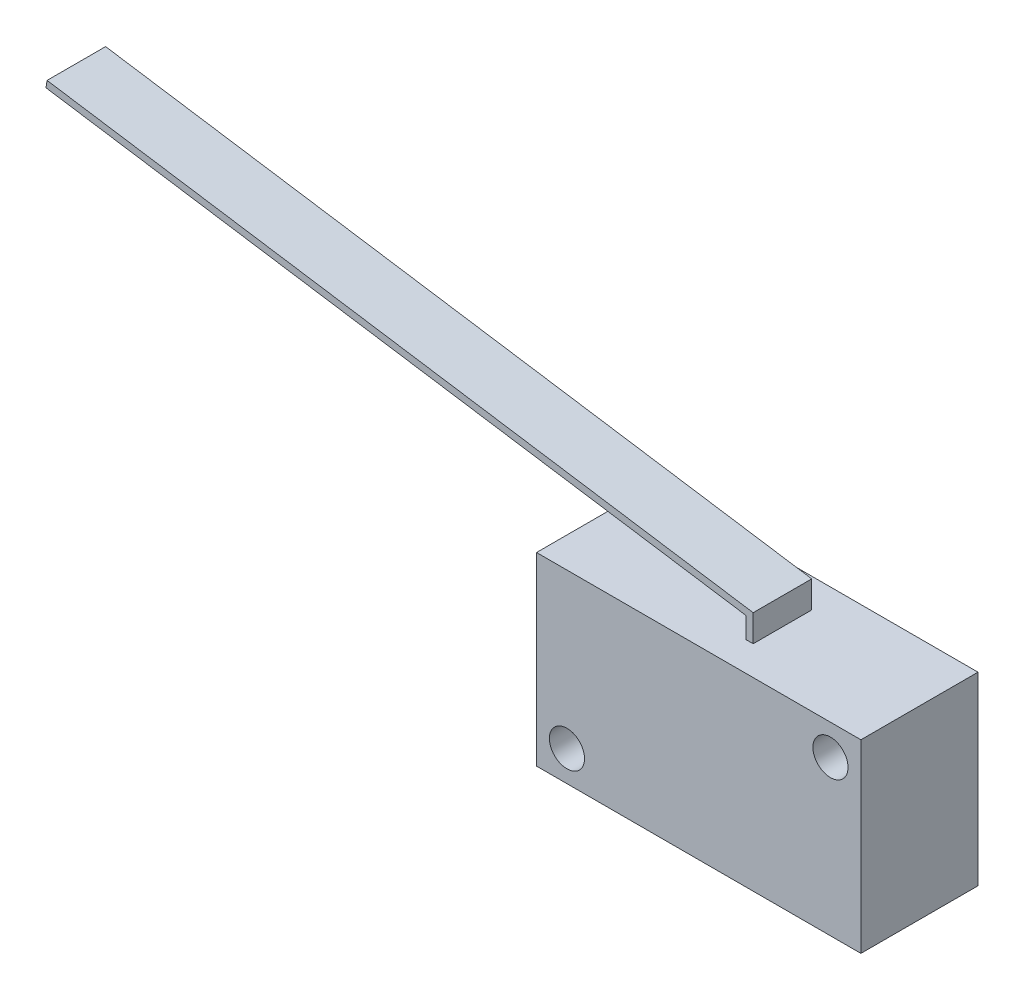
ISO-10303-21;
HEADER;
FILE_DESCRIPTION(('STEP AP214'),'2;1');
FILE_NAME('part.step','',(''),(''),'','','');
FILE_SCHEMA(('AUTOMOTIVE_DESIGN { 1 0 10303 214 1 1 1 1 }'));
ENDSEC;
DATA;
#1=APPLICATION_CONTEXT('core data for automotive mechanical design processes');
#2=APPLICATION_PROTOCOL_DEFINITION('international standard','automotive_design',2000,#1);
#3=PRODUCT_CONTEXT('',#1,'mechanical');
#4=PRODUCT('Part','Part','',(#3));
#5=PRODUCT_RELATED_PRODUCT_CATEGORY('part','',(#4));
#6=PRODUCT_DEFINITION_FORMATION('','',#4);
#7=PRODUCT_DEFINITION_CONTEXT('part definition',#1,'design');
#8=PRODUCT_DEFINITION('design','',#6,#7);
#9=PRODUCT_DEFINITION_SHAPE('','',#8);
#10=(LENGTH_UNIT() NAMED_UNIT(*) SI_UNIT(.MILLI.,.METRE.));
#11=(NAMED_UNIT(*) PLANE_ANGLE_UNIT() SI_UNIT($,.RADIAN.));
#12=(NAMED_UNIT(*) SI_UNIT($,.STERADIAN.) SOLID_ANGLE_UNIT());
#13=UNCERTAINTY_MEASURE_WITH_UNIT(LENGTH_MEASURE(1.E-05),#10,'distance_accuracy_value','');
#14=(GEOMETRIC_REPRESENTATION_CONTEXT(3) GLOBAL_UNCERTAINTY_ASSIGNED_CONTEXT((#13)) GLOBAL_UNIT_ASSIGNED_CONTEXT((#10,
#11,#12)) REPRESENTATION_CONTEXT('',''));
#15=CARTESIAN_POINT('',(0.,0.,0.));
#16=DIRECTION('',(0.,0.,1.));
#17=DIRECTION('',(1.,0.,0.));
#18=AXIS2_PLACEMENT_3D('',#15,#16,#17);
#19=CARTESIAN_POINT('',(13.85,7.9,5.));
#20=DIRECTION('',(0.,-1.,0.));
#21=DIRECTION('',(1.,0.,0.));
#22=AXIS2_PLACEMENT_3D('',#19,#20,#21);
#23=PLANE('',#22);
#24=DIRECTION('',(-1.,0.,0.));
#25=VECTOR('',#24,1.);
#26=CARTESIAN_POINT('',(13.85,7.9,-5.));
#27=LINE('',#26,#25);
#28=CARTESIAN_POINT('',(13.85,7.9,-5.));
#29=VERTEX_POINT('',#28);
#30=CARTESIAN_POINT('',(-13.85,7.90000000000001,-5.));
#31=VERTEX_POINT('',#30);
#32=EDGE_CURVE('E81',#29,#31,#27,.T.);
#33=ORIENTED_EDGE('',*,*,#32,.T.);
#34=DIRECTION('',(0.,0.,-1.));
#35=VECTOR('',#34,1.);
#36=CARTESIAN_POINT('',(-13.85,7.90000000000001,5.));
#37=LINE('',#36,#35);
#38=CARTESIAN_POINT('',(-13.85,7.90000000000001,5.));
#39=VERTEX_POINT('',#38);
#40=EDGE_CURVE('E198',#39,#31,#37,.T.);
#41=ORIENTED_EDGE('',*,*,#40,.F.);
#42=DIRECTION('',(-1.,0.,0.));
#43=VECTOR('',#42,1.);
#44=CARTESIAN_POINT('',(13.85,7.9,5.));
#45=LINE('',#44,#43);
#46=CARTESIAN_POINT('',(13.85,7.9,5.));
#47=VERTEX_POINT('',#46);
#48=EDGE_CURVE('E60',#47,#39,#45,.T.);
#49=ORIENTED_EDGE('',*,*,#48,.F.);
#50=DIRECTION('',(0.,0.,-1.));
#51=VECTOR('',#50,1.);
#52=CARTESIAN_POINT('',(13.85,7.9,5.));
#53=LINE('',#52,#51);
#54=EDGE_CURVE('E207',#47,#29,#53,.T.);
#55=ORIENTED_EDGE('',*,*,#54,.T.);
#56=EDGE_LOOP('',(#33,#41,#49,#55));
#57=FACE_BOUND('',#56,.T.);
#58=DIRECTION('',(-1.,0.,0.));
#59=VECTOR('',#58,1.);
#60=CARTESIAN_POINT('',(2.14999999999999,7.9,2.5));
#61=LINE('',#60,#59);
#62=CARTESIAN_POINT('',(2.14999999999999,7.9,2.5));
#63=VERTEX_POINT('',#62);
#64=CARTESIAN_POINT('',(1.54999999999999,7.9,2.5));
#65=VERTEX_POINT('',#64);
#66=EDGE_CURVE('E154',#63,#65,#61,.T.);
#67=ORIENTED_EDGE('',*,*,#66,.T.);
#68=DIRECTION('',(0.,0.,-1.));
#69=VECTOR('',#68,1.);
#70=CARTESIAN_POINT('',(1.54999999999999,7.9,2.5));
#71=LINE('',#70,#69);
#72=CARTESIAN_POINT('',(1.54999999999999,7.9,-2.5));
#73=VERTEX_POINT('',#72);
#74=EDGE_CURVE('E174',#65,#73,#71,.T.);
#75=ORIENTED_EDGE('',*,*,#74,.T.);
#76=DIRECTION('',(-1.,0.,0.));
#77=VECTOR('',#76,1.);
#78=CARTESIAN_POINT('',(2.14999999999999,7.9,-2.5));
#79=LINE('',#78,#77);
#80=CARTESIAN_POINT('',(2.14999999999999,7.90000000000001,-2.5));
#81=VERTEX_POINT('',#80);
#82=EDGE_CURVE('E168',#81,#73,#79,.T.);
#83=ORIENTED_EDGE('',*,*,#82,.F.);
#84=DIRECTION('',(0.,0.,-1.));
#85=VECTOR('',#84,1.);
#86=CARTESIAN_POINT('',(2.14999999999999,7.9,2.5));
#87=LINE('',#86,#85);
#88=EDGE_CURVE('E172',#63,#81,#87,.T.);
#89=ORIENTED_EDGE('',*,*,#88,.F.);
#90=EDGE_LOOP('',(#67,#75,#83,#89));
#91=FACE_BOUND('',#90,.T.);
#92=ADVANCED_FACE('F36',(#57,#91),#23,.F.);
#93=CARTESIAN_POINT('',(-13.85,7.90000000000001,5.));
#94=DIRECTION('',(0.,0.,1.));
#95=DIRECTION('',(1.,0.,0.));
#96=AXIS2_PLACEMENT_3D('',#93,#94,#95);
#97=PLANE('',#96);
#98=CARTESIAN_POINT('',(-11.25,-5.29999999999999,5.));
#99=DIRECTION('',(0.,0.,1.));
#100=DIRECTION('',(1.,0.,0.));
#101=AXIS2_PLACEMENT_3D('',#98,#99,#100);
#102=CIRCLE('',#101,1.5);
#103=CARTESIAN_POINT('',(-9.75000000000001,-5.29999999999999,5.));
#104=VERTEX_POINT('',#103);
#105=EDGE_CURVE('E186',#104,#104,#102,.T.);
#106=ORIENTED_EDGE('',*,*,#105,.F.);
#107=EDGE_LOOP('',(#106));
#108=FACE_BOUND('',#107,.T.);
#109=DIRECTION('',(0.,-1.,0.));
#110=VECTOR('',#109,1.);
#111=CARTESIAN_POINT('',(-13.85,-7.89999999999999,5.));
#112=LINE('',#111,#110);
#113=CARTESIAN_POINT('',(-13.85,-7.89999999999999,5.));
#114=VERTEX_POINT('',#113);
#115=EDGE_CURVE('E192',#39,#114,#112,.T.);
#116=ORIENTED_EDGE('',*,*,#115,.T.);
#117=DIRECTION('',(1.,0.,0.));
#118=VECTOR('',#117,1.);
#119=CARTESIAN_POINT('',(13.85,-7.89999999999999,5.));
#120=LINE('',#119,#118);
#121=CARTESIAN_POINT('',(13.85,-7.89999999999999,5.));
#122=VERTEX_POINT('',#121);
#123=EDGE_CURVE('E88',#114,#122,#120,.T.);
#124=ORIENTED_EDGE('',*,*,#123,.T.);
#125=DIRECTION('',(0.,1.,0.));
#126=VECTOR('',#125,1.);
#127=CARTESIAN_POINT('',(13.85,-7.89999999999999,5.));
#128=LINE('',#127,#126);
#129=EDGE_CURVE('E195',#122,#47,#128,.T.);
#130=ORIENTED_EDGE('',*,*,#129,.T.);
#131=ORIENTED_EDGE('',*,*,#48,.T.);
#132=EDGE_LOOP('',(#116,#124,#130,#131));
#133=FACE_BOUND('',#132,.T.);
#134=CARTESIAN_POINT('',(11.25,5.30000000000001,5.));
#135=DIRECTION('',(0.,0.,1.));
#136=DIRECTION('',(1.,0.,0.));
#137=AXIS2_PLACEMENT_3D('',#134,#135,#136);
#138=CIRCLE('',#137,1.5);
#139=CARTESIAN_POINT('',(12.75,5.30000000000001,5.));
#140=VERTEX_POINT('',#139);
#141=EDGE_CURVE('E180',#140,#140,#138,.T.);
#142=ORIENTED_EDGE('',*,*,#141,.F.);
#143=EDGE_LOOP('',(#142));
#144=FACE_BOUND('',#143,.T.);
#145=ADVANCED_FACE('F223',(#108,#133,#144),#97,.T.);
#146=CARTESIAN_POINT('',(-13.85,7.90000000000001,-5.));
#147=DIRECTION('',(0.,0.,1.));
#148=DIRECTION('',(1.,0.,0.));
#149=AXIS2_PLACEMENT_3D('',#146,#147,#148);
#150=PLANE('',#149);
#151=DIRECTION('',(0.,-1.,0.));
#152=VECTOR('',#151,1.);
#153=CARTESIAN_POINT('',(-13.85,-7.89999999999999,-5.));
#154=LINE('',#153,#152);
#155=CARTESIAN_POINT('',(-13.85,-7.89999999999999,-5.));
#156=VERTEX_POINT('',#155);
#157=EDGE_CURVE('E189',#31,#156,#154,.T.);
#158=ORIENTED_EDGE('',*,*,#157,.F.);
#159=ORIENTED_EDGE('',*,*,#32,.F.);
#160=DIRECTION('',(0.,1.,0.));
#161=VECTOR('',#160,1.);
#162=CARTESIAN_POINT('',(13.85,-7.89999999999999,-5.));
#163=LINE('',#162,#161);
#164=CARTESIAN_POINT('',(13.85,-7.89999999999999,-5.));
#165=VERTEX_POINT('',#164);
#166=EDGE_CURVE('E203',#165,#29,#163,.T.);
#167=ORIENTED_EDGE('',*,*,#166,.F.);
#168=DIRECTION('',(1.,0.,0.));
#169=VECTOR('',#168,1.);
#170=CARTESIAN_POINT('',(13.85,-7.89999999999999,-5.));
#171=LINE('',#170,#169);
#172=EDGE_CURVE('E201',#156,#165,#171,.T.);
#173=ORIENTED_EDGE('',*,*,#172,.F.);
#174=EDGE_LOOP('',(#158,#159,#167,#173));
#175=FACE_BOUND('',#174,.T.);
#176=CARTESIAN_POINT('',(-11.25,-5.29999999999999,-5.));
#177=DIRECTION('',(0.,0.,1.));
#178=DIRECTION('',(1.,0.,0.));
#179=AXIS2_PLACEMENT_3D('',#176,#177,#178);
#180=CIRCLE('',#179,1.5);
#181=CARTESIAN_POINT('',(-9.75000000000001,-5.29999999999999,-5.));
#182=VERTEX_POINT('',#181);
#183=EDGE_CURVE('E183',#182,#182,#180,.T.);
#184=ORIENTED_EDGE('',*,*,#183,.T.);
#185=EDGE_LOOP('',(#184));
#186=FACE_BOUND('',#185,.T.);
#187=CARTESIAN_POINT('',(11.25,5.30000000000001,-5.));
#188=DIRECTION('',(0.,0.,1.));
#189=DIRECTION('',(1.,0.,0.));
#190=AXIS2_PLACEMENT_3D('',#187,#188,#189);
#191=CIRCLE('',#190,1.5);
#192=CARTESIAN_POINT('',(12.75,5.30000000000001,-5.));
#193=VERTEX_POINT('',#192);
#194=EDGE_CURVE('E143',#193,#193,#191,.T.);
#195=ORIENTED_EDGE('',*,*,#194,.T.);
#196=EDGE_LOOP('',(#195));
#197=FACE_BOUND('',#196,.T.);
#198=ADVANCED_FACE('F216',(#175,#186,#197),#150,.F.);
#199=CARTESIAN_POINT('',(-13.85,-7.89999999999999,5.));
#200=DIRECTION('',(1.,0.,0.));
#201=DIRECTION('',(0.,0.,-1.));
#202=AXIS2_PLACEMENT_3D('',#199,#200,#201);
#203=PLANE('',#202);
#204=ORIENTED_EDGE('',*,*,#157,.T.);
#205=DIRECTION('',(0.,0.,-1.));
#206=VECTOR('',#205,1.);
#207=CARTESIAN_POINT('',(-13.85,-7.89999999999999,5.));
#208=LINE('',#207,#206);
#209=EDGE_CURVE('E11',#114,#156,#208,.T.);
#210=ORIENTED_EDGE('',*,*,#209,.F.);
#211=ORIENTED_EDGE('',*,*,#115,.F.);
#212=ORIENTED_EDGE('',*,*,#40,.T.);
#213=EDGE_LOOP('',(#204,#210,#211,#212));
#214=FACE_BOUND('',#213,.T.);
#215=ADVANCED_FACE('F38',(#214),#203,.F.);
#216=CARTESIAN_POINT('',(13.85,-7.89999999999999,5.));
#217=DIRECTION('',(0.,1.,0.));
#218=DIRECTION('',(0.,0.,1.));
#219=AXIS2_PLACEMENT_3D('',#216,#217,#218);
#220=PLANE('',#219);
#221=ORIENTED_EDGE('',*,*,#172,.T.);
#222=DIRECTION('',(0.,0.,-1.));
#223=VECTOR('',#222,1.);
#224=CARTESIAN_POINT('',(13.85,-7.89999999999999,5.));
#225=LINE('',#224,#223);
#226=EDGE_CURVE('E44',#122,#165,#225,.T.);
#227=ORIENTED_EDGE('',*,*,#226,.F.);
#228=ORIENTED_EDGE('',*,*,#123,.F.);
#229=ORIENTED_EDGE('',*,*,#209,.T.);
#230=EDGE_LOOP('',(#221,#227,#228,#229));
#231=FACE_BOUND('',#230,.T.);
#232=ADVANCED_FACE('F267',(#231),#220,.F.);
#233=CARTESIAN_POINT('',(13.85,-7.89999999999999,5.));
#234=DIRECTION('',(-1.,0.,0.));
#235=DIRECTION('',(0.,0.,1.));
#236=AXIS2_PLACEMENT_3D('',#233,#234,#235);
#237=PLANE('',#236);
#238=ORIENTED_EDGE('',*,*,#166,.T.);
#239=ORIENTED_EDGE('',*,*,#54,.F.);
#240=ORIENTED_EDGE('',*,*,#129,.F.);
#241=ORIENTED_EDGE('',*,*,#226,.T.);
#242=EDGE_LOOP('',(#238,#239,#240,#241));
#243=FACE_BOUND('',#242,.T.);
#244=ADVANCED_FACE('F212',(#243),#237,.F.);
#245=CARTESIAN_POINT('',(-11.25,-5.29999999999999,5.));
#246=DIRECTION('',(0.,0.,-1.));
#247=DIRECTION('',(-1.,0.,0.));
#248=AXIS2_PLACEMENT_3D('',#245,#246,#247);
#249=CYLINDRICAL_SURFACE('',#248,1.5);
#250=ORIENTED_EDGE('',*,*,#105,.T.);
#251=EDGE_LOOP('',(#250));
#252=FACE_BOUND('',#251,.T.);
#253=ORIENTED_EDGE('',*,*,#183,.F.);
#254=EDGE_LOOP('',(#253));
#255=FACE_BOUND('',#254,.T.);
#256=ADVANCED_FACE('F256',(#252,#255),#249,.F.);
#257=CARTESIAN_POINT('',(11.25,5.30000000000001,5.));
#258=DIRECTION('',(0.,0.,-1.));
#259=DIRECTION('',(-1.,0.,0.));
#260=AXIS2_PLACEMENT_3D('',#257,#258,#259);
#261=CYLINDRICAL_SURFACE('',#260,1.5);
#262=ORIENTED_EDGE('',*,*,#141,.T.);
#263=EDGE_LOOP('',(#262));
#264=FACE_BOUND('',#263,.T.);
#265=ORIENTED_EDGE('',*,*,#194,.F.);
#266=EDGE_LOOP('',(#265));
#267=FACE_BOUND('',#266,.T.);
#268=ADVANCED_FACE('F253',(#264,#267),#261,.F.);
#269=CARTESIAN_POINT('',(2.14999999999999,10.2,2.5));
#270=DIRECTION('',(-0.151060036545824,-0.988524590163934,0.));
#271=DIRECTION('',(0.988524590163934,-0.151060036545824,0.));
#272=AXIS2_PLACEMENT_3D('',#269,#270,#271);
#273=PLANE('',#272);
#274=DIRECTION('',(-0.988524590163934,0.151060036545824,0.));
#275=VECTOR('',#274,1.);
#276=CARTESIAN_POINT('',(2.14999999999999,10.2,-2.5));
#277=LINE('',#276,#275);
#278=CARTESIAN_POINT('',(2.14999999999999,10.2,-2.5));
#279=VERTEX_POINT('',#278);
#280=CARTESIAN_POINT('',(-58.15,19.4146622292953,-2.5));
#281=VERTEX_POINT('',#280);
#282=EDGE_CURVE('E139',#279,#281,#277,.T.);
#283=ORIENTED_EDGE('',*,*,#282,.T.);
#284=DIRECTION('',(0.,0.,-1.));
#285=VECTOR('',#284,1.);
#286=CARTESIAN_POINT('',(-58.15,19.4146622292953,2.5));
#287=LINE('',#286,#285);
#288=CARTESIAN_POINT('',(-58.15,19.4146622292953,2.5));
#289=VERTEX_POINT('',#288);
#290=EDGE_CURVE('E137',#289,#281,#287,.T.);
#291=ORIENTED_EDGE('',*,*,#290,.F.);
#292=DIRECTION('',(-0.988524590163934,0.151060036545824,0.));
#293=VECTOR('',#292,1.);
#294=CARTESIAN_POINT('',(2.14999999999999,10.2,2.5));
#295=LINE('',#294,#293);
#296=CARTESIAN_POINT('',(2.14999999999999,10.2,2.5));
#297=VERTEX_POINT('',#296);
#298=EDGE_CURVE('E123',#297,#289,#295,.T.);
#299=ORIENTED_EDGE('',*,*,#298,.F.);
#300=DIRECTION('',(0.,0.,-1.));
#301=VECTOR('',#300,1.);
#302=CARTESIAN_POINT('',(2.14999999999999,10.2,2.5));
#303=LINE('',#302,#301);
#304=EDGE_CURVE('E158',#297,#279,#303,.T.);
#305=ORIENTED_EDGE('',*,*,#304,.T.);
#306=EDGE_LOOP('',(#283,#291,#299,#305));
#307=FACE_BOUND('',#306,.T.);
#308=ADVANCED_FACE('F138',(#307),#273,.F.);
#309=CARTESIAN_POINT('',(-58.2406360219275,18.8215474751969,2.5));
#310=DIRECTION('',(-0.98852459016393,0.151060036545855,0.));
#311=DIRECTION('',(-0.151060036545855,-0.98852459016393,0.));
#312=AXIS2_PLACEMENT_3D('',#309,#310,#311);
#313=PLANE('',#312);
#314=DIRECTION('',(0.151060036545856,0.98852459016393,0.));
#315=VECTOR('',#314,1.);
#316=CARTESIAN_POINT('',(-58.2406360219275,18.8215474751969,-2.5));
#317=LINE('',#316,#315);
#318=CARTESIAN_POINT('',(-58.2406360219275,18.8215474751969,-2.5));
#319=VERTEX_POINT('',#318);
#320=EDGE_CURVE('E160',#319,#281,#317,.T.);
#321=ORIENTED_EDGE('',*,*,#320,.F.);
#322=DIRECTION('',(0.,0.,-1.));
#323=VECTOR('',#322,1.);
#324=CARTESIAN_POINT('',(-58.2406360219275,18.8215474751969,2.5));
#325=LINE('',#324,#323);
#326=CARTESIAN_POINT('',(-58.2406360219275,18.8215474751969,2.5));
#327=VERTEX_POINT('',#326);
#328=EDGE_CURVE('E144',#327,#319,#325,.T.);
#329=ORIENTED_EDGE('',*,*,#328,.F.);
#330=DIRECTION('',(0.151060036545856,0.98852459016393,0.));
#331=VECTOR('',#330,1.);
#332=CARTESIAN_POINT('',(-58.2406360219275,18.8215474751969,2.5));
#333=LINE('',#332,#331);
#334=EDGE_CURVE('E128',#327,#289,#333,.T.);
#335=ORIENTED_EDGE('',*,*,#334,.T.);
#336=ORIENTED_EDGE('',*,*,#290,.T.);
#337=EDGE_LOOP('',(#321,#329,#335,#336));
#338=FACE_BOUND('',#337,.T.);
#339=ADVANCED_FACE('F146',(#338),#313,.T.);
#340=CARTESIAN_POINT('',(2.05936397807249,9.60688524590164,2.5));
#341=DIRECTION('',(-0.151060036545824,-0.988524590163934,0.));
#342=DIRECTION('',(0.988524590163934,-0.151060036545824,0.));
#343=AXIS2_PLACEMENT_3D('',#340,#341,#342);
#344=PLANE('',#343);
#345=DIRECTION('',(-0.988524590163934,0.151060036545824,0.));
#346=VECTOR('',#345,1.);
#347=CARTESIAN_POINT('',(2.05936397807249,9.60688524590164,-2.5));
#348=LINE('',#347,#346);
#349=CARTESIAN_POINT('',(1.54999999999999,9.68472300725667,-2.5));
#350=VERTEX_POINT('',#349);
#351=EDGE_CURVE('E162',#350,#319,#348,.T.);
#352=ORIENTED_EDGE('',*,*,#351,.F.);
#353=DIRECTION('',(0.,0.,-1.));
#354=VECTOR('',#353,1.);
#355=CARTESIAN_POINT('',(1.54999999999999,9.68472300725667,2.5));
#356=LINE('',#355,#354);
#357=CARTESIAN_POINT('',(1.54999999999999,9.68472300725667,2.5));
#358=VERTEX_POINT('',#357);
#359=EDGE_CURVE('E177',#358,#350,#356,.T.);
#360=ORIENTED_EDGE('',*,*,#359,.F.);
#361=DIRECTION('',(-0.988524590163934,0.151060036545824,0.));
#362=VECTOR('',#361,1.);
#363=CARTESIAN_POINT('',(2.05936397807249,9.60688524590164,2.5));
#364=LINE('',#363,#362);
#365=EDGE_CURVE('E147',#358,#327,#364,.T.);
#366=ORIENTED_EDGE('',*,*,#365,.T.);
#367=ORIENTED_EDGE('',*,*,#328,.T.);
#368=EDGE_LOOP('',(#352,#360,#366,#367));
#369=FACE_BOUND('',#368,.T.);
#370=ADVANCED_FACE('F245',(#369),#344,.T.);
#371=CARTESIAN_POINT('',(1.54999999999999,7.9,2.5));
#372=DIRECTION('',(-1.,0.,0.));
#373=DIRECTION('',(0.,0.,1.));
#374=AXIS2_PLACEMENT_3D('',#371,#372,#373);
#375=PLANE('',#374);
#376=DIRECTION('',(0.,1.,0.));
#377=VECTOR('',#376,1.);
#378=CARTESIAN_POINT('',(1.54999999999999,7.9,-2.5));
#379=LINE('',#378,#377);
#380=EDGE_CURVE('E165',#73,#350,#379,.T.);
#381=ORIENTED_EDGE('',*,*,#380,.F.);
#382=ORIENTED_EDGE('',*,*,#74,.F.);
#383=DIRECTION('',(0.,1.,0.));
#384=VECTOR('',#383,1.);
#385=CARTESIAN_POINT('',(1.54999999999999,7.9,2.5));
#386=LINE('',#385,#384);
#387=EDGE_CURVE('E149',#65,#358,#386,.T.);
#388=ORIENTED_EDGE('',*,*,#387,.T.);
#389=ORIENTED_EDGE('',*,*,#359,.T.);
#390=EDGE_LOOP('',(#381,#382,#388,#389));
#391=FACE_BOUND('',#390,.T.);
#392=ADVANCED_FACE('F229',(#391),#375,.T.);
#393=CARTESIAN_POINT('',(2.14999999999999,7.9,2.5));
#394=DIRECTION('',(-1.,0.,0.));
#395=DIRECTION('',(0.,0.,1.));
#396=AXIS2_PLACEMENT_3D('',#393,#394,#395);
#397=PLANE('',#396);
#398=DIRECTION('',(0.,1.,0.));
#399=VECTOR('',#398,1.);
#400=CARTESIAN_POINT('',(2.14999999999999,7.9,-2.5));
#401=LINE('',#400,#399);
#402=EDGE_CURVE('E51',#81,#279,#401,.T.);
#403=ORIENTED_EDGE('',*,*,#402,.T.);
#404=ORIENTED_EDGE('',*,*,#304,.F.);
#405=DIRECTION('',(0.,1.,0.));
#406=VECTOR('',#405,1.);
#407=CARTESIAN_POINT('',(2.14999999999999,7.9,2.5));
#408=LINE('',#407,#406);
#409=EDGE_CURVE('E131',#63,#297,#408,.T.);
#410=ORIENTED_EDGE('',*,*,#409,.F.);
#411=ORIENTED_EDGE('',*,*,#88,.T.);
#412=EDGE_LOOP('',(#403,#404,#410,#411));
#413=FACE_BOUND('',#412,.T.);
#414=ADVANCED_FACE('F237',(#413),#397,.F.);
#415=CARTESIAN_POINT('',(-58.15,19.4146622292953,2.5));
#416=DIRECTION('',(0.,0.,-1.));
#417=DIRECTION('',(-1.,0.,0.));
#418=AXIS2_PLACEMENT_3D('',#415,#416,#417);
#419=PLANE('',#418);
#420=ORIENTED_EDGE('',*,*,#298,.T.);
#421=ORIENTED_EDGE('',*,*,#334,.F.);
#422=ORIENTED_EDGE('',*,*,#365,.F.);
#423=ORIENTED_EDGE('',*,*,#387,.F.);
#424=ORIENTED_EDGE('',*,*,#66,.F.);
#425=ORIENTED_EDGE('',*,*,#409,.T.);
#426=EDGE_LOOP('',(#420,#421,#422,#423,#424,#425));
#427=FACE_BOUND('',#426,.T.);
#428=ADVANCED_FACE('F125',(#427),#419,.F.);
#429=CARTESIAN_POINT('',(-58.15,19.4146622292953,-2.5));
#430=DIRECTION('',(0.,0.,-1.));
#431=DIRECTION('',(-1.,0.,0.));
#432=AXIS2_PLACEMENT_3D('',#429,#430,#431);
#433=PLANE('',#432);
#434=ORIENTED_EDGE('',*,*,#282,.F.);
#435=ORIENTED_EDGE('',*,*,#402,.F.);
#436=ORIENTED_EDGE('',*,*,#82,.T.);
#437=ORIENTED_EDGE('',*,*,#380,.T.);
#438=ORIENTED_EDGE('',*,*,#351,.T.);
#439=ORIENTED_EDGE('',*,*,#320,.T.);
#440=EDGE_LOOP('',(#434,#435,#436,#437,#438,#439));
#441=FACE_BOUND('',#440,.T.);
#442=ADVANCED_FACE('F231',(#441),#433,.T.);
#443=CLOSED_SHELL('',(#92,#145,#198,#215,#232,#244,#256,#268,#308,#339,#370,#392,#414,#428,#442));
#444=MANIFOLD_SOLID_BREP('B2',#443);
#445=ADVANCED_BREP_SHAPE_REPRESENTATION('',(#18,#444),#14);
#446=SHAPE_DEFINITION_REPRESENTATION(#9,#445);
ENDSEC;
END-ISO-10303-21;
